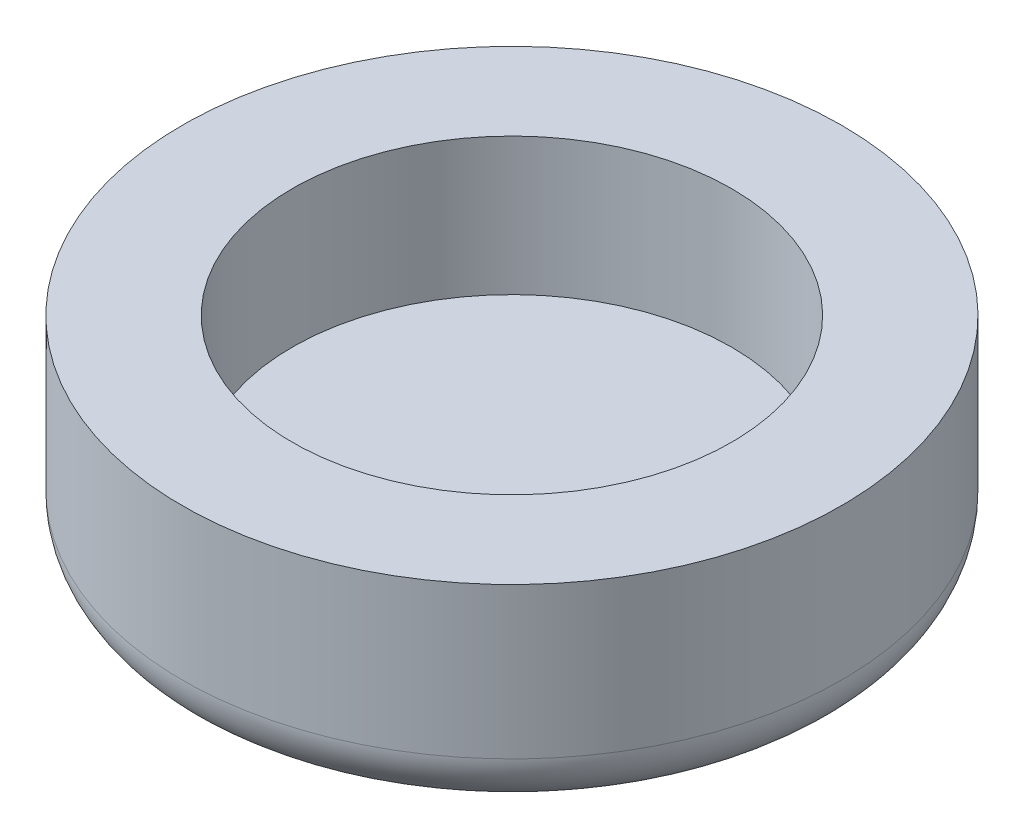
ISO-10303-21;
HEADER;
FILE_DESCRIPTION(('STEP AP214'),'2;1');
FILE_NAME('part.step','',(''),(''),'','','');
FILE_SCHEMA(('AUTOMOTIVE_DESIGN { 1 0 10303 214 1 1 1 1 }'));
ENDSEC;
DATA;
#1=APPLICATION_CONTEXT('core data for automotive mechanical design processes');
#2=APPLICATION_PROTOCOL_DEFINITION('international standard','automotive_design',2000,#1);
#3=PRODUCT_CONTEXT('',#1,'mechanical');
#4=PRODUCT('Part','Part','',(#3));
#5=PRODUCT_RELATED_PRODUCT_CATEGORY('part','',(#4));
#6=PRODUCT_DEFINITION_FORMATION('','',#4);
#7=PRODUCT_DEFINITION_CONTEXT('part definition',#1,'design');
#8=PRODUCT_DEFINITION('design','',#6,#7);
#9=PRODUCT_DEFINITION_SHAPE('','',#8);
#10=(LENGTH_UNIT() NAMED_UNIT(*) SI_UNIT(.MILLI.,.METRE.));
#11=(NAMED_UNIT(*) PLANE_ANGLE_UNIT() SI_UNIT($,.RADIAN.));
#12=(NAMED_UNIT(*) SI_UNIT($,.STERADIAN.) SOLID_ANGLE_UNIT());
#13=UNCERTAINTY_MEASURE_WITH_UNIT(LENGTH_MEASURE(1.E-05),#10,'distance_accuracy_value','');
#14=(GEOMETRIC_REPRESENTATION_CONTEXT(3) GLOBAL_UNCERTAINTY_ASSIGNED_CONTEXT((#13)) GLOBAL_UNIT_ASSIGNED_CONTEXT((#10,
#11,#12)) REPRESENTATION_CONTEXT('',''));
#15=CARTESIAN_POINT('',(0.,0.,0.));
#16=DIRECTION('',(0.,0.,1.));
#17=DIRECTION('',(1.,0.,0.));
#18=AXIS2_PLACEMENT_3D('',#15,#16,#17);
#19=CARTESIAN_POINT('',(0.,0.,0.));
#20=DIRECTION('',(0.,-1.,0.));
#21=DIRECTION('',(0.,0.,-1.));
#22=AXIS2_PLACEMENT_3D('',#19,#20,#21);
#23=PLANE('',#22);
#24=CARTESIAN_POINT('',(0.,0.,0.));
#25=DIRECTION('',(0.,-1.,0.));
#26=DIRECTION('',(0.,0.,-1.));
#27=AXIS2_PLACEMENT_3D('',#24,#25,#26);
#28=CIRCLE('',#27,2.);
#29=CARTESIAN_POINT('',(0.,0.,-2.));
#30=VERTEX_POINT('',#29);
#31=EDGE_CURVE('E44',#30,#30,#28,.T.);
#32=ORIENTED_EDGE('',*,*,#31,.T.);
#33=EDGE_LOOP('',(#32));
#34=FACE_BOUND('',#33,.T.);
#35=ADVANCED_FACE('F36',(#34),#23,.T.);
#36=CARTESIAN_POINT('',(0.,0.,0.));
#37=DIRECTION('',(0.,-1.,0.));
#38=DIRECTION('',(0.,0.,-1.));
#39=AXIS2_PLACEMENT_3D('',#36,#37,#38);
#40=CYLINDRICAL_SURFACE('',#39,2.4);
#41=CARTESIAN_POINT('',(0.,0.4,0.));
#42=DIRECTION('',(0.,-1.,0.));
#43=DIRECTION('',(0.,0.,-1.));
#44=AXIS2_PLACEMENT_3D('',#41,#42,#43);
#45=CIRCLE('',#44,2.4);
#46=CARTESIAN_POINT('',(0.,0.4,-2.4));
#47=VERTEX_POINT('',#46);
#48=EDGE_CURVE('E10',#47,#47,#45,.F.);
#49=ORIENTED_EDGE('',*,*,#48,.T.);
#50=EDGE_LOOP('',(#49));
#51=FACE_BOUND('',#50,.T.);
#52=CARTESIAN_POINT('',(0.,1.5,0.));
#53=DIRECTION('',(0.,-1.,0.));
#54=DIRECTION('',(0.,0.,-1.));
#55=AXIS2_PLACEMENT_3D('',#52,#53,#54);
#56=CIRCLE('',#55,2.4);
#57=CARTESIAN_POINT('',(0.,1.5,-2.4));
#58=VERTEX_POINT('',#57);
#59=EDGE_CURVE('E50',#58,#58,#56,.T.);
#60=ORIENTED_EDGE('',*,*,#59,.T.);
#61=EDGE_LOOP('',(#60));
#62=FACE_BOUND('',#61,.T.);
#63=ADVANCED_FACE('F79',(#51,#62),#40,.T.);
#64=CARTESIAN_POINT('',(2.4,1.5,0.));
#65=DIRECTION('',(0.,1.,0.));
#66=DIRECTION('',(0.,0.,1.));
#67=AXIS2_PLACEMENT_3D('',#64,#65,#66);
#68=PLANE('',#67);
#69=CARTESIAN_POINT('',(0.,1.5,0.));
#70=DIRECTION('',(0.,-1.,0.));
#71=DIRECTION('',(0.,0.,-1.));
#72=AXIS2_PLACEMENT_3D('',#69,#70,#71);
#73=CIRCLE('',#72,1.6);
#74=CARTESIAN_POINT('',(0.,1.5,-1.6));
#75=VERTEX_POINT('',#74);
#76=EDGE_CURVE('E56',#75,#75,#73,.T.);
#77=ORIENTED_EDGE('',*,*,#76,.T.);
#78=EDGE_LOOP('',(#77));
#79=FACE_BOUND('',#78,.T.);
#80=ORIENTED_EDGE('',*,*,#59,.F.);
#81=EDGE_LOOP('',(#80));
#82=FACE_BOUND('',#81,.T.);
#83=ADVANCED_FACE('F76',(#79,#82),#68,.T.);
#84=CARTESIAN_POINT('',(0.,0.,0.));
#85=DIRECTION('',(0.,-1.,0.));
#86=DIRECTION('',(0.,0.,-1.));
#87=AXIS2_PLACEMENT_3D('',#84,#85,#86);
#88=CYLINDRICAL_SURFACE('',#87,1.6);
#89=CARTESIAN_POINT('',(0.,0.5,0.));
#90=DIRECTION('',(0.,-1.,0.));
#91=DIRECTION('',(0.,0.,-1.));
#92=AXIS2_PLACEMENT_3D('',#89,#90,#91);
#93=CIRCLE('',#92,1.6);
#94=CARTESIAN_POINT('',(0.,0.5,-1.6));
#95=VERTEX_POINT('',#94);
#96=EDGE_CURVE('E61',#95,#95,#93,.T.);
#97=ORIENTED_EDGE('',*,*,#96,.T.);
#98=EDGE_LOOP('',(#97));
#99=FACE_BOUND('',#98,.T.);
#100=ORIENTED_EDGE('',*,*,#76,.F.);
#101=EDGE_LOOP('',(#100));
#102=FACE_BOUND('',#101,.T.);
#103=ADVANCED_FACE('F65',(#99,#102),#88,.F.);
#104=CARTESIAN_POINT('',(1.6,0.5,0.));
#105=DIRECTION('',(0.,1.,0.));
#106=DIRECTION('',(0.,0.,1.));
#107=AXIS2_PLACEMENT_3D('',#104,#105,#106);
#108=PLANE('',#107);
#109=ORIENTED_EDGE('',*,*,#96,.F.);
#110=EDGE_LOOP('',(#109));
#111=FACE_BOUND('',#110,.T.);
#112=ADVANCED_FACE('F68',(#111),#108,.T.);
#113=CARTESIAN_POINT('',(0.,0.4,0.));
#114=DIRECTION('',(0.,-1.,0.));
#115=DIRECTION('',(0.,0.,-1.));
#116=AXIS2_PLACEMENT_3D('',#113,#114,#115);
#117=TOROIDAL_SURFACE('',#116,2.,0.4);
#118=ORIENTED_EDGE('',*,*,#48,.F.);
#119=EDGE_LOOP('',(#118));
#120=FACE_BOUND('',#119,.T.);
#121=ORIENTED_EDGE('',*,*,#31,.F.);
#122=EDGE_LOOP('',(#121));
#123=FACE_BOUND('',#122,.T.);
#124=ADVANCED_FACE('F38',(#120,#123),#117,.T.);
#125=CLOSED_SHELL('',(#35,#63,#83,#103,#112,#124));
#126=MANIFOLD_SOLID_BREP('B2',#125);
#127=ADVANCED_BREP_SHAPE_REPRESENTATION('',(#18,#126),#14);
#128=SHAPE_DEFINITION_REPRESENTATION(#9,#127);
ENDSEC;
END-ISO-10303-21;
